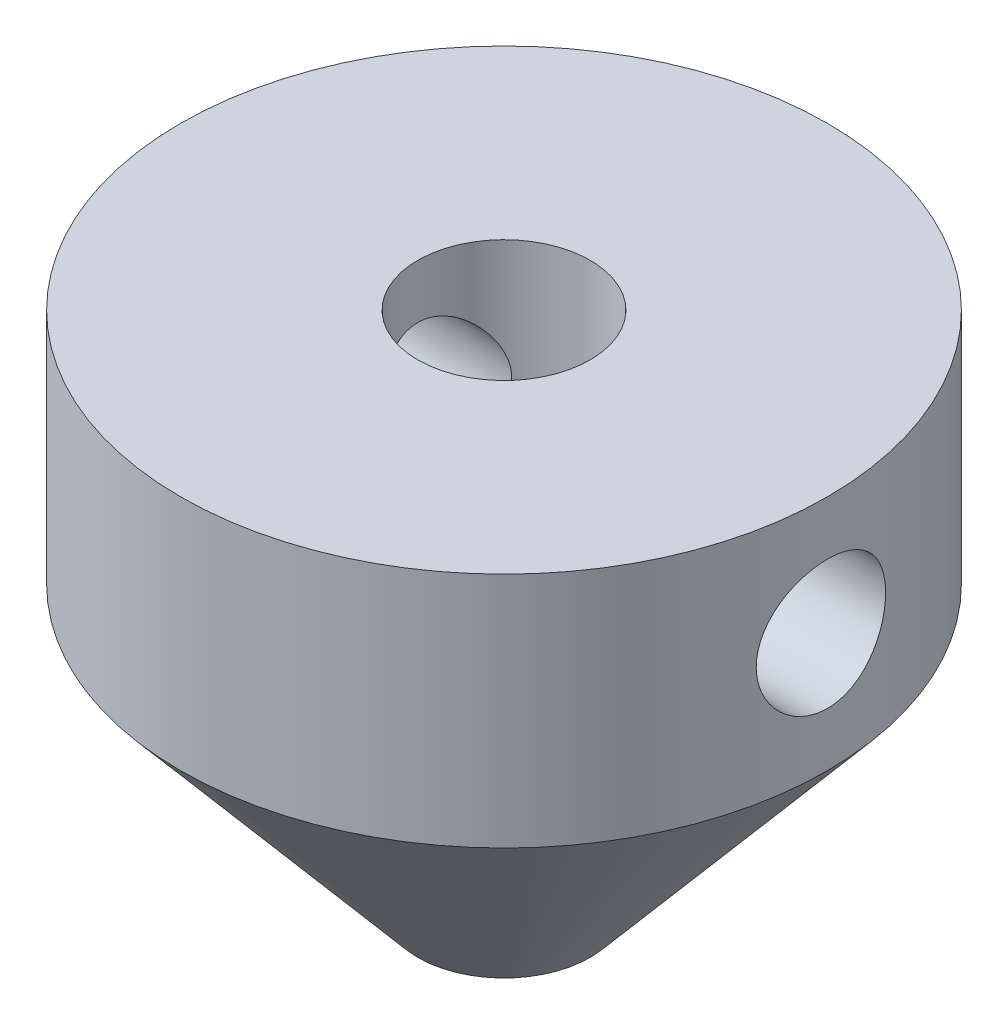
ISO-10303-21;
HEADER;
FILE_DESCRIPTION(('STEP AP214'),'2;1');
FILE_NAME('part.step','',(''),(''),'','','');
FILE_SCHEMA(('AUTOMOTIVE_DESIGN { 1 0 10303 214 1 1 1 1 }'));
ENDSEC;
DATA;
#1=APPLICATION_CONTEXT('core data for automotive mechanical design processes');
#2=APPLICATION_PROTOCOL_DEFINITION('international standard','automotive_design',2000,#1);
#3=PRODUCT_CONTEXT('',#1,'mechanical');
#4=PRODUCT('Part','Part','',(#3));
#5=PRODUCT_RELATED_PRODUCT_CATEGORY('part','',(#4));
#6=PRODUCT_DEFINITION_FORMATION('','',#4);
#7=PRODUCT_DEFINITION_CONTEXT('part definition',#1,'design');
#8=PRODUCT_DEFINITION('design','',#6,#7);
#9=PRODUCT_DEFINITION_SHAPE('','',#8);
#10=(LENGTH_UNIT() NAMED_UNIT(*) SI_UNIT(.MILLI.,.METRE.));
#11=(NAMED_UNIT(*) PLANE_ANGLE_UNIT() SI_UNIT($,.RADIAN.));
#12=(NAMED_UNIT(*) SI_UNIT($,.STERADIAN.) SOLID_ANGLE_UNIT());
#13=UNCERTAINTY_MEASURE_WITH_UNIT(LENGTH_MEASURE(1.E-05),#10,'distance_accuracy_value','');
#14=(GEOMETRIC_REPRESENTATION_CONTEXT(3) GLOBAL_UNCERTAINTY_ASSIGNED_CONTEXT((#13)) GLOBAL_UNIT_ASSIGNED_CONTEXT((#10,
#11,#12)) REPRESENTATION_CONTEXT('',''));
#15=CARTESIAN_POINT('',(0.,0.,0.));
#16=DIRECTION('',(0.,0.,1.));
#17=DIRECTION('',(1.,0.,0.));
#18=AXIS2_PLACEMENT_3D('',#15,#16,#17);
#19=CARTESIAN_POINT('',(-7.5,-2.75,0.));
#20=DIRECTION('',(1.,0.,0.));
#21=DIRECTION('',(0.,0.,-1.));
#22=AXIS2_PLACEMENT_3D('',#19,#20,#21);
#23=CYLINDRICAL_SURFACE('',#22,1.5);
#24=CARTESIAN_POINT('',(-1.32287565553229,-2.75,-1.5));
#25=CARTESIAN_POINT('',(-1.32289190044095,-2.68000257657437,-1.49999219049447));
#26=CARTESIAN_POINT('',(-1.32856366615417,-2.60995416568808,-1.4950410907442));
#27=CARTESIAN_POINT('',(-1.34990644032801,-2.47267014379052,-1.47578333210409));
#28=CARTESIAN_POINT('',(-1.3656072516867,-2.40544355498049,-1.46144878565587));
#29=CARTESIAN_POINT('',(-1.4037512791687,-2.27642015326163,-1.42483838991846));
#30=CARTESIAN_POINT('',(-1.42609848244814,-2.21456122323754,-1.40267483444956));
#31=CARTESIAN_POINT('',(-1.47486455031267,-2.09565454555481,-1.35130655299363));
#32=CARTESIAN_POINT('',(-1.50128292264932,-2.03860621753078,-1.3221026780169));
#33=CARTESIAN_POINT('',(-1.56177312961147,-1.91788720368341,-1.25039909811054));
#34=CARTESIAN_POINT('',(-1.59628904009787,-1.85533206577353,-1.20639573950363));
#35=CARTESIAN_POINT('',(-1.66521164096378,-1.73747453375773,-1.10933596759308));
#36=CARTESIAN_POINT('',(-1.69961809339876,-1.68218303517973,-1.05626622282799));
#37=CARTESIAN_POINT('',(-1.77262582436251,-1.56914126134453,-0.929610192252514));
#38=CARTESIAN_POINT('',(-1.81064921229759,-1.51319403328015,-0.854047289142163));
#39=CARTESIAN_POINT('',(-1.87882809751632,-1.41537779171717,-0.69118971482194));
#40=CARTESIAN_POINT('',(-1.90900204180106,-1.37347570253119,-0.603923293836167));
#41=CARTESIAN_POINT('',(-1.95034258990248,-1.31679231409706,-0.447869023983645));
#42=CARTESIAN_POINT('',(-1.96449710921006,-1.29764290402153,-0.381446049692536));
#43=CARTESIAN_POINT('',(-1.98605635937555,-1.26860988400325,-0.245552609316542));
#44=CARTESIAN_POINT('',(-1.99346695432364,-1.25871822389326,-0.176084845995169));
#45=CARTESIAN_POINT('',(-2.00091375578087,-1.24877826613751,-0.0358650926220277));
#46=CARTESIAN_POINT('',(-2.00093080057495,-1.24875554562356,0.0348897591186388));
#47=CARTESIAN_POINT('',(-1.99354206503066,-1.25861793678029,0.175316156674036));
#48=CARTESIAN_POINT('',(-1.98613456571337,-1.26850534290815,0.244987447822227));
#49=CARTESIAN_POINT('',(-1.96491377944411,-1.29708105058987,0.378889193792651));
#50=CARTESIAN_POINT('',(-1.9513285776568,-1.31545632638708,0.443224268236295));
#51=CARTESIAN_POINT('',(-1.91882278657017,-1.35999564218224,0.567680485046397));
#52=CARTESIAN_POINT('',(-1.89990103394193,-1.38616138051316,0.627800705033636));
#53=CARTESIAN_POINT('',(-1.85561045984504,-1.44852961514532,0.74921692186473));
#54=CARTESIAN_POINT('',(-1.82976540608097,-1.48551209661876,0.809935384713598));
#55=CARTESIAN_POINT('',(-1.77460702483739,-1.56673370397052,0.924567250548284));
#56=CARTESIAN_POINT('',(-1.74529074780453,-1.6109790136999,0.978474784621221));
#57=CARTESIAN_POINT('',(-1.6789376587236,-1.71522334882094,1.08908204283329));
#58=CARTESIAN_POINT('',(-1.64151655866368,-1.7766092100264,1.14424493004784));
#59=CARTESIAN_POINT('',(-1.56725958283769,-1.90783458362195,1.24400875556228));
#60=CARTESIAN_POINT('',(-1.53042399363524,-1.97767809952506,1.28860466211477));
#61=CARTESIAN_POINT('',(-1.46819425999159,-2.11098187024563,1.358732064116));
#62=CARTESIAN_POINT('',(-1.44197599789983,-2.17298704530065,1.38628866868102));
#63=CARTESIAN_POINT('',(-1.39536741257394,-2.30206528141938,1.43319397108784));
#64=CARTESIAN_POINT('',(-1.37496395320511,-2.36912647969037,1.45256121808259));
#65=CARTESIAN_POINT('',(-1.34640050620232,-2.49368694399832,1.47902385350669));
#66=CARTESIAN_POINT('',(-1.3366153955687,-2.55044708211686,1.48779069496582));
#67=CARTESIAN_POINT('',(-1.32435588438334,-2.66535546617383,1.49871760619789));
#68=CARTESIAN_POINT('',(-1.32187213058307,-2.72350183990282,1.50088612873265));
#69=CARTESIAN_POINT('',(-1.32462868790497,-2.8394789917334,1.49845270115552));
#70=CARTESIAN_POINT('',(-1.32987184207164,-2.89730964580967,1.4938482589949));
#71=CARTESIAN_POINT('',(-1.34721218775046,-3.01107615244287,1.47822527271969));
#72=CARTESIAN_POINT('',(-1.35932107727345,-3.0670085979481,1.46719578056394));
#73=CARTESIAN_POINT('',(-1.39427758287802,-3.19633804493887,1.43413959562387));
#74=CARTESIAN_POINT('',(-1.41944823697315,-3.26843595391503,1.40954189769242));
#75=CARTESIAN_POINT('',(-1.47537861079975,-3.40630766364012,1.35088877838435));
#76=CARTESIAN_POINT('',(-1.5061485847723,-3.47206951729475,1.31681594335477));
#77=CARTESIAN_POINT('',(-1.5710828237565,-3.59934900804812,1.23869774116696));
#78=CARTESIAN_POINT('',(-1.60532883846046,-3.66063287621826,1.19434110060341));
#79=CARTESIAN_POINT('',(-1.67347506272361,-3.77600209636125,1.09682562914592));
#80=CARTESIAN_POINT('',(-1.70737509574665,-3.83008392798894,1.04366252194463));
#81=CARTESIAN_POINT('',(-1.77960222623532,-3.94127699162937,0.916234513829622));
#82=CARTESIAN_POINT('',(-1.81728174165357,-3.9964752388576,0.839896270946857));
#83=CARTESIAN_POINT('',(-1.88453104769825,-4.09262073345087,0.675551612651268));
#84=CARTESIAN_POINT('',(-1.91411836052283,-4.13359882458129,0.587571029974851));
#85=CARTESIAN_POINT('',(-1.95419406402379,-4.18843799144687,0.430755661496911));
#86=CARTESIAN_POINT('',(-1.9677547802964,-4.20675679327544,0.364250057327472));
#87=CARTESIAN_POINT('',(-1.98810265589123,-4.23412879630752,0.228364464964352));
#88=CARTESIAN_POINT('',(-1.9948958710696,-4.24319028154851,0.158987104561943));
#89=CARTESIAN_POINT('',(-2.00113566717062,-4.25151639092861,0.0191476059403991));
#90=CARTESIAN_POINT('',(-2.00056500218907,-4.25075801734825,-0.0513166925870871));
#91=CARTESIAN_POINT('',(-1.9920880324381,-4.23943900869876,-0.19100901103008));
#92=CARTESIAN_POINT('',(-1.98417977344351,-4.22887576229252,-0.260236696591288));
#93=CARTESIAN_POINT('',(-1.96203400925195,-4.19902508383276,-0.393521935254971));
#94=CARTESIAN_POINT('',(-1.94798690792879,-4.17999981867845,-0.457671236511441));
#95=CARTESIAN_POINT('',(-1.91462720575136,-4.13421193438106,-0.581661343097388));
#96=CARTESIAN_POINT('',(-1.89531347862386,-4.10744766016909,-0.641501223388814));
#97=CARTESIAN_POINT('',(-1.8501764221064,-4.04372206240404,-0.762547698766812));
#98=CARTESIAN_POINT('',(-1.82386352707581,-4.00594906864042,-0.823141236713417));
#99=CARTESIAN_POINT('',(-1.76785506075717,-3.92313355944579,-0.937414811724214));
#100=CARTESIAN_POINT('',(-1.73815638795658,-3.87808436271395,-0.991088412383373));
#101=CARTESIAN_POINT('',(-1.67106353042106,-3.77199463343921,-1.10112380660681));
#102=CARTESIAN_POINT('',(-1.63330922504697,-3.7095536005601,-1.15591691541996));
#103=CARTESIAN_POINT('',(-1.55866082463332,-3.57613192810013,-1.2547525342935));
#104=CARTESIAN_POINT('',(-1.52176704921892,-3.50514817396344,-1.29879110556729));
#105=CARTESIAN_POINT('',(-1.46049601449284,-3.3711167494097,-1.36695971301455));
#106=CARTESIAN_POINT('',(-1.43513625007637,-3.30966501729344,-1.39333526337998));
#107=CARTESIAN_POINT('',(-1.39032564651232,-3.18191708694412,-1.43805398028599));
#108=CARTESIAN_POINT('',(-1.37085915899696,-3.11563430840455,-1.45641847678344));
#109=CARTESIAN_POINT('',(-1.34532423383262,-2.99921178040307,-1.4799705775638));
#110=CARTESIAN_POINT('',(-1.3370013026568,-2.95003292870954,-1.48744249026867));
#111=CARTESIAN_POINT('',(-1.32577295392455,-2.85057766696635,-1.49745839072448));
#112=CARTESIAN_POINT('',(-1.32286398151145,-2.80030199905628,-1.50000561211714));
#113=CARTESIAN_POINT('',(-1.32287565553229,-2.75,-1.5));
#114=B_SPLINE_CURVE_WITH_KNOTS('',3,(#24,#25,#26,#27,#28,#29,#30,#31,#32,#33,#34,#35,#36,#37,
#38,#39,#40,#41,#42,#43,#44,#45,#46,#47,#48,#49,#50,#51,#52,#53,#54,#55,#56,#57,#58,#59,#60,#61,
#62,#63,#64,#65,#66,#67,#68,#69,#70,#71,#72,#73,#74,#75,#76,#77,#78,#79,#80,#81,#82,#83,#84,#85,
#86,#87,#88,#89,#90,#91,#92,#93,#94,#95,#96,#97,#98,#99,#100,#101,#102,#103,#104,#105,#106,#107,
#108,#109,#110,#111,#112,#113),.UNSPECIFIED.,.T.,.F.,(4,2,2,2,2,2,2,2,2,2,2,2,2,2,2,2,2,2,2,2,2,
2,2,2,2,2,2,2,2,2,2,2,2,2,2,2,2,2,2,2,2,2,2,2,4),(0.,0.20973177668449,0.420089722582994,
0.627545385620139,0.834975984672345,1.08585208691169,1.33710031031849,1.63964848103538,
1.94147907444963,2.15227725277555,2.36289195870711,2.57405250727807,2.78526195641288,
2.9892375589505,3.19325766108669,3.41936844116895,3.64567274887663,3.91649517204702,
4.18744629647933,4.40499409477196,4.62204646613006,4.79608005545901,4.96989060538193,
5.14376512326213,5.31793678696019,5.55730028202397,5.79710662639151,6.0454320909006,
6.29387849446618,6.59652499511463,6.89851088586565,7.10852896194427,7.31835893539181,
7.52868041101043,7.73905791773945,7.94332812691912,8.14764205379332,8.3751005248961,
8.60276905744644,8.87547580578155,9.14828228208531,9.36218279640835,9.57551025772699,
9.72632812073766,9.87704692032409),.UNSPECIFIED.);
#115=CARTESIAN_POINT('',(-1.32287565553229,-2.75,-1.5));
#116=VERTEX_POINT('',#115);
#117=EDGE_CURVE('E34',#116,#116,#114,.T.);
#118=ORIENTED_EDGE('',*,*,#117,.T.);
#119=EDGE_LOOP('',(#118));
#120=FACE_BOUND('',#119,.T.);
#121=CARTESIAN_POINT('',(-7.5,-4.25,0.));
#122=CARTESIAN_POINT('',(-7.49999846371307,-4.24999693325248,-0.0833653601889498));
#123=CARTESIAN_POINT('',(-7.49859577767346,-4.24302673554853,-0.166769490302284));
#124=CARTESIAN_POINT('',(-7.49313548434847,-4.21535224982713,-0.331220261533529));
#125=CARTESIAN_POINT('',(-7.48907576790279,-4.19463705079774,-0.412264976312034));
#126=CARTESIAN_POINT('',(-7.4787547391743,-4.14013808956882,-0.56959545789497));
#127=CARTESIAN_POINT('',(-7.47249553615077,-4.10636684473297,-0.645885701899702));
#128=CARTESIAN_POINT('',(-7.45845597052971,-4.02675162873306,-0.791711983296339));
#129=CARTESIAN_POINT('',(-7.4506756985356,-3.98090837658919,-0.861248422613718));
#130=CARTESIAN_POINT('',(-7.43433247994955,-3.87779225856285,-0.992540215972298));
#131=CARTESIAN_POINT('',(-7.42576118256521,-3.8203874669132,-1.05419092673779));
#132=CARTESIAN_POINT('',(-7.40886270678882,-3.69606137541245,-1.16705513491204));
#133=CARTESIAN_POINT('',(-7.40053554750636,-3.62913933299732,-1.21826781715564));
#134=CARTESIAN_POINT('',(-7.38498662718923,-3.48692571048219,-1.30924763002143));
#135=CARTESIAN_POINT('',(-7.37777561047419,-3.41156353430546,-1.3489064082988));
#136=CARTESIAN_POINT('',(-7.36539402087627,-3.25507727149388,-1.41495849987046));
#137=CARTESIAN_POINT('',(-7.36022324642942,-3.17395375498048,-1.44135312365586));
#138=CARTESIAN_POINT('',(-7.35259207878307,-3.00937345413813,-1.47978794982724));
#139=CARTESIAN_POINT('',(-7.35009705160781,-2.92596118378666,-1.49201174693817));
#140=CARTESIAN_POINT('',(-7.34799562590941,-2.75823526795349,-1.50232819158918));
#141=CARTESIAN_POINT('',(-7.34838893201761,-2.67392171551978,-1.50042228407025));
#142=CARTESIAN_POINT('',(-7.35198826722277,-2.5081298179685,-1.48268185965273));
#143=CARTESIAN_POINT('',(-7.35515179288145,-2.42662789155903,-1.46705781036586));
#144=CARTESIAN_POINT('',(-7.36386819240002,-2.2674258850055,-1.42265682693458));
#145=CARTESIAN_POINT('',(-7.36942118036668,-2.18972598662149,-1.39387926465102));
#146=CARTESIAN_POINT('',(-7.38233427750612,-2.0397271074446,-1.32378717551208));
#147=CARTESIAN_POINT('',(-7.38970634720557,-1.96746818064624,-1.28238922684817));
#148=CARTESIAN_POINT('',(-7.40541928159593,-1.83084372504078,-1.18829036185902));
#149=CARTESIAN_POINT('',(-7.41376025757549,-1.76647910472326,-1.13558814653524));
#150=CARTESIAN_POINT('',(-7.43065531862193,-1.6462558963146,-1.01924990184088));
#151=CARTESIAN_POINT('',(-7.43921053816357,-1.59057114821131,-0.955434241818667));
#152=CARTESIAN_POINT('',(-7.45543273071613,-1.49066923054817,-0.819277536093015));
#153=CARTESIAN_POINT('',(-7.4630996923346,-1.44645220805963,-0.746936381069084));
#154=CARTESIAN_POINT('',(-7.47670035241331,-1.37070873616104,-0.595589080318381));
#155=CARTESIAN_POINT('',(-7.48263133272408,-1.3392021595332,-0.51657272937795));
#156=CARTESIAN_POINT('',(-7.49207113481787,-1.28995928894215,-0.354223464672997));
#157=CARTESIAN_POINT('',(-7.49558025000797,-1.27222132688956,-0.270891075108674));
#158=CARTESIAN_POINT('',(-7.49974007800302,-1.25126531930859,-0.103769108440725));
#159=CARTESIAN_POINT('',(-7.50043761978705,-1.2478093706896,-0.0200104924883639));
#160=CARTESIAN_POINT('',(-7.49902577895154,-1.25487478841327,0.146887401289071));
#161=CARTESIAN_POINT('',(-7.49691655412169,-1.26539536902889,0.23002671366569));
#162=CARTESIAN_POINT('',(-7.49015748012026,-1.29991756031594,0.392558489919812));
#163=CARTESIAN_POINT('',(-7.4855306460631,-1.32379710274686,0.471977922509855));
#164=CARTESIAN_POINT('',(-7.47425328091549,-1.38422597398372,0.625685441249501));
#165=CARTESIAN_POINT('',(-7.4676025982134,-1.42077625201525,0.69997314245631));
#166=CARTESIAN_POINT('',(-7.45289867299942,-1.50602373597697,0.842311760529327));
#167=CARTESIAN_POINT('',(-7.44482925655578,-1.55486417155842,0.910275190128283));
#168=CARTESIAN_POINT('',(-7.42822102244824,-1.66311378681092,1.03712702867881));
#169=CARTESIAN_POINT('',(-7.41968215452582,-1.7225240995998,1.09601446339614));
#170=CARTESIAN_POINT('',(-7.40293955335447,-1.85131002783669,1.20396088616126));
#171=CARTESIAN_POINT('',(-7.39474290349956,-1.92082361633201,1.25285655367298));
#172=CARTESIAN_POINT('',(-7.37976287694291,-2.06721704203502,1.33827813007681));
#173=CARTESIAN_POINT('',(-7.37297944370014,-2.14409658436033,1.37480453388435));
#174=CARTESIAN_POINT('',(-7.36165110876574,-2.30265236922432,1.43422776237294));
#175=CARTESIAN_POINT('',(-7.3570946230828,-2.38430126181548,1.45719524968658));
#176=CARTESIAN_POINT('',(-7.35071155188038,-2.55040018023636,1.48906297744079));
#177=CARTESIAN_POINT('',(-7.34888461036667,-2.63484983931402,1.49796505233767));
#178=CARTESIAN_POINT('',(-7.34818724447069,-2.80251329681648,1.5013813663012));
#179=CARTESIAN_POINT('',(-7.34926378783951,-2.88572172339052,1.49615368210634));
#180=CARTESIAN_POINT('',(-7.35413360226921,-3.05004747485754,1.47202845615009));
#181=CARTESIAN_POINT('',(-7.35792685150754,-3.13116481654221,1.45313102419395));
#182=CARTESIAN_POINT('',(-7.36777896328738,-3.28884156686082,1.40231785274843));
#183=CARTESIAN_POINT('',(-7.37383231528246,-3.36541154075363,1.37043376007602));
#184=CARTESIAN_POINT('',(-7.38752572461255,-3.51215558110166,1.29458196690241));
#185=CARTESIAN_POINT('',(-7.39516591498341,-3.58232911058771,1.25061325316232));
#186=CARTESIAN_POINT('',(-7.41133440784838,-3.71557335822547,1.15095887217962));
#187=CARTESIAN_POINT('',(-7.41987559364549,-3.7785031479014,1.09508683085277));
#188=CARTESIAN_POINT('',(-7.43679122807932,-3.89417930829376,0.973596553519711));
#189=CARTESIAN_POINT('',(-7.44516563794777,-3.94692333547591,0.907976080730002));
#190=CARTESIAN_POINT('',(-7.46090748581957,-4.04125196591967,0.768026443632369));
#191=CARTESIAN_POINT('',(-7.46826346828869,-4.08271400492004,0.693613326644751));
#192=CARTESIAN_POINT('',(-7.481026876275,-4.15247918389489,0.538749541411098));
#193=CARTESIAN_POINT('',(-7.48643605707924,-4.18079418429874,0.458304391294689));
#194=CARTESIAN_POINT('',(-7.49364558893056,-4.21797792206708,0.314732233385669));
#195=CARTESIAN_POINT('',(-7.49601454737677,-4.22996479056164,0.252422496020677));
#196=CARTESIAN_POINT('',(-7.49919231209839,-4.24597686853755,0.1267492878151));
#197=CARTESIAN_POINT('',(-7.50000116809732,-4.25000233176465,0.0633858506229285));
#198=CARTESIAN_POINT('',(-7.5,-4.25,0.));
#199=B_SPLINE_CURVE_WITH_KNOTS('',3,(#121,#122,#123,#124,#125,#126,#127,#128,#129,#130,#131,
#132,#133,#134,#135,#136,#137,#138,#139,#140,#141,#142,#143,#144,#145,#146,#147,#148,#149,#150,
#151,#152,#153,#154,#155,#156,#157,#158,#159,#160,#161,#162,#163,#164,#165,#166,#167,#168,#169,
#170,#171,#172,#173,#174,#175,#176,#177,#178,#179,#180,#181,#182,#183,#184,#185,#186,#187,#188,
#189,#190,#191,#192,#193,#194,#195,#196,#197,#198),.UNSPECIFIED.,.T.,.F.,(4,2,2,2,2,2,2,2,2,2,2,
2,2,2,2,2,2,2,2,2,2,2,2,2,2,2,2,2,2,2,2,2,2,2,2,2,2,2,4),(0.,0.249864195991888,
0.499926976036985,0.749750602875513,0.999559353346295,1.25239900516828,1.50525839512105,
1.76041792508884,2.01555224047796,2.26734277655381,2.51910756421838,2.76707590509417,
3.01505608880594,3.26471235305389,3.51439732124506,3.76857378737026,4.0227535130973,
4.27732912281036,4.53187388547054,4.78216103514398,5.03243411486801,5.28045680926085,
5.52849808824034,5.77957599050038,6.03068082518895,6.28560942868839,6.540527830852,
6.79410571549085,7.04765052495622,7.29659583851552,7.54553915238913,7.79387941879665,
8.042240513728,8.29482114358715,8.54745981799396,8.80274245013456,9.05779433276278,
9.24778162934841,9.43776287056494),.UNSPECIFIED.);
#200=CARTESIAN_POINT('',(-7.5,-4.25,0.));
#201=VERTEX_POINT('',#200);
#202=EDGE_CURVE('E10',#201,#201,#199,.T.);
#203=ORIENTED_EDGE('',*,*,#202,.F.);
#204=EDGE_LOOP('',(#203));
#205=FACE_BOUND('',#204,.T.);
#206=ADVANCED_FACE('F30',(#120,#205),#23,.F.);
#207=CARTESIAN_POINT('',(0.,0.,0.));
#208=DIRECTION('',(0.,-1.,0.));
#209=DIRECTION('',(0.,0.,-1.));
#210=AXIS2_PLACEMENT_3D('',#207,#208,#209);
#211=PLANE('',#210);
#212=CARTESIAN_POINT('',(0.,0.,0.));
#213=DIRECTION('',(0.,1.,0.));
#214=DIRECTION('',(0.,0.,1.));
#215=AXIS2_PLACEMENT_3D('',#212,#213,#214);
#216=CIRCLE('',#215,2.);
#217=CARTESIAN_POINT('',(0.,0.,2.));
#218=VERTEX_POINT('',#217);
#219=EDGE_CURVE('E98',#218,#218,#216,.T.);
#220=ORIENTED_EDGE('',*,*,#219,.F.);
#221=EDGE_LOOP('',(#220));
#222=FACE_BOUND('',#221,.T.);
#223=CARTESIAN_POINT('',(0.,0.,0.));
#224=DIRECTION('',(0.,-1.,0.));
#225=DIRECTION('',(0.,0.,-1.));
#226=AXIS2_PLACEMENT_3D('',#223,#224,#225);
#227=CIRCLE('',#226,7.5);
#228=CARTESIAN_POINT('',(0.,0.,-7.5));
#229=VERTEX_POINT('',#228);
#230=EDGE_CURVE('E48',#229,#229,#227,.T.);
#231=ORIENTED_EDGE('',*,*,#230,.F.);
#232=EDGE_LOOP('',(#231));
#233=FACE_BOUND('',#232,.T.);
#234=ADVANCED_FACE('F32',(#222,#233),#211,.F.);
#235=CARTESIAN_POINT('',(0.,-12.,0.));
#236=DIRECTION('',(0.,-1.,0.));
#237=DIRECTION('',(0.,0.,-1.));
#238=AXIS2_PLACEMENT_3D('',#235,#236,#237);
#239=CYLINDRICAL_SURFACE('',#238,7.5);
#240=ORIENTED_EDGE('',*,*,#202,.T.);
#241=EDGE_LOOP('',(#240));
#242=FACE_BOUND('',#241,.T.);
#243=CARTESIAN_POINT('',(7.34846922834953,-2.75,-1.5));
#244=CARTESIAN_POINT('',(7.34847088538349,-2.83334656323576,-1.49999691881235));
#245=CARTESIAN_POINT('',(7.34990262402618,-2.91673193499975,-1.49302975757707));
#246=CARTESIAN_POINT('',(7.35546646957746,-3.08114375771496,-1.46536842537441));
#247=CARTESIAN_POINT('',(7.35960073717297,-3.16216826695404,-1.44466327060578));
#248=CARTESIAN_POINT('',(7.37008310582665,-3.31945595503125,-1.39019367392958));
#249=CARTESIAN_POINT('',(7.37642900431582,-3.39572378229887,-1.35644222122892));
#250=CARTESIAN_POINT('',(7.39061699221019,-3.54151226704545,-1.27687366150577));
#251=CARTESIAN_POINT('',(7.398458998102,-3.61103330080686,-1.23105722790173));
#252=CARTESIAN_POINT('',(7.4148794954137,-3.74234150578079,-1.12796861348015));
#253=CARTESIAN_POINT('',(7.42346606755867,-3.80401938182596,-1.07055848386998));
#254=CARTESIAN_POINT('',(7.440337084539,-3.91693630036847,-0.946210183531966));
#255=CARTESIAN_POINT('',(7.44862150816248,-3.96817461112579,-0.879271345466977));
#256=CARTESIAN_POINT('',(7.46404194626342,-4.05918202644269,-0.737042033886384));
#257=CARTESIAN_POINT('',(7.47116732162326,-4.09884727072496,-0.661683851508316));
#258=CARTESIAN_POINT('',(7.48337605325447,-4.16491240557221,-0.505206225580907));
#259=CARTESIAN_POINT('',(7.48845960066179,-4.19131353785149,-0.42408732213083));
#260=CARTESIAN_POINT('',(7.49595481032628,-4.22976079042944,-0.259525159917742));
#261=CARTESIAN_POINT('',(7.4984007943219,-4.24199146635651,-0.176126608822221));
#262=CARTESIAN_POINT('',(7.50046381775405,-4.25232642775747,-0.00842785265630482));
#263=CARTESIAN_POINT('',(7.50008112979138,-4.25043207446873,0.0758722647477644));
#264=CARTESIAN_POINT('',(7.49655652302773,-4.23271072967667,0.241713001115383));
#265=CARTESIAN_POINT('',(7.49345397548757,-4.21708253424823,0.323275821447705));
#266=CARTESIAN_POINT('',(7.48488265739113,-4.17265245131166,0.482597439870452));
#267=CARTESIAN_POINT('',(7.47941379216059,-4.14385003671219,0.560356085620693));
#268=CARTESIAN_POINT('',(7.46665944029938,-4.0737049397791,0.710429194801331));
#269=CARTESIAN_POINT('',(7.45936272262835,-4.03228437334267,0.782706261200849));
#270=CARTESIAN_POINT('',(7.44375704210678,-3.9381363841451,0.919357568789633));
#271=CARTESIAN_POINT('',(7.43544796282833,-3.88540766034423,0.983730899287501));
#272=CARTESIAN_POINT('',(7.41856446546689,-3.76904956683729,1.10392714658019));
#273=CARTESIAN_POINT('',(7.40998794686274,-3.70524621990562,1.15958147486045));
#274=CARTESIAN_POINT('',(7.39367357398141,-3.56912533632387,1.25942773976521));
#275=CARTESIAN_POINT('',(7.38593573556822,-3.49680763867521,1.30361945959163));
#276=CARTESIAN_POINT('',(7.37217071209385,-3.34546875226729,1.37934422220282));
#277=CARTESIAN_POINT('',(7.36614722345324,-3.26643354854051,1.41084997166656));
#278=CARTESIAN_POINT('',(7.35654714481909,-3.10404301441402,1.46008551244137));
#279=CARTESIAN_POINT('',(7.35297023592642,-3.02068824857138,1.47781709918496));
#280=CARTESIAN_POINT('',(7.34873218901742,-2.85355271300143,1.49874900905408));
#281=CARTESIAN_POINT('',(7.34802220585731,-2.76980363853449,1.50219278834687));
#282=CARTESIAN_POINT('',(7.34946728533281,-2.60292766520048,1.49510644246611));
#283=CARTESIAN_POINT('',(7.35162218550582,-2.51980073132171,1.48457710968366));
#284=CARTESIAN_POINT('',(7.35850848742372,-2.35734703956165,1.45005331211124));
#285=CARTESIAN_POINT('',(7.36321498521745,-2.27799148544636,1.42618893125895));
#286=CARTESIAN_POINT('',(7.37465234027497,-2.12440508145689,1.36581155296278));
#287=CARTESIAN_POINT('',(7.38138336429404,-2.05017465434642,1.32929751355977));
#288=CARTESIAN_POINT('',(7.39622108943059,-1.90788033507476,1.2441062133234));
#289=CARTESIAN_POINT('',(7.40434457797355,-1.83990943054876,1.19527661697413));
#290=CARTESIAN_POINT('',(7.42100585739955,-1.71303753199863,1.08704335831907));
#291=CARTESIAN_POINT('',(7.42954369085727,-1.65413747262612,1.02763860771681));
#292=CARTESIAN_POINT('',(7.44623018803823,-1.54615616122164,0.898848410246836));
#293=CARTESIAN_POINT('',(7.45437086563026,-1.49723951802501,0.829323748394445));
#294=CARTESIAN_POINT('',(7.4692069144293,-1.41178117775063,0.682901844952133));
#295=CARTESIAN_POINT('',(7.47590234632816,-1.37523896098283,0.60600491315026));
#296=CARTESIAN_POINT('',(7.487059410916,-1.31580669238005,0.447454021236019));
#297=CARTESIAN_POINT('',(7.49153368713906,-1.29283922266062,0.365830010217117));
#298=CARTESIAN_POINT('',(7.4977985390649,-1.26096312850423,0.199784182019869));
#299=CARTESIAN_POINT('',(7.49958943799765,-1.25205281078648,0.115362703066821));
#300=CARTESIAN_POINT('',(7.50027810681181,-1.24860952855567,-0.0523093408554353));
#301=CARTESIAN_POINT('',(7.49922567824026,-1.25382907931568,-0.135554718212254));
#302=CARTESIAN_POINT('',(7.49445065340477,-1.27795092582172,-0.299956546973463));
#303=CARTESIAN_POINT('',(7.49072809071528,-1.29685304952211,-0.381113024630537));
#304=CARTESIAN_POINT('',(7.481032475475,-1.34769348813747,-0.538879124617644));
#305=CARTESIAN_POINT('',(7.47506455871866,-1.37960206719678,-0.615498664860421));
#306=CARTESIAN_POINT('',(7.46152083185077,-1.45551836199635,-0.762331830278929));
#307=CARTESIAN_POINT('',(7.45394489468828,-1.49952703385557,-0.832544948651118));
#308=CARTESIAN_POINT('',(7.43786398736791,-1.59922908059313,-0.965795835159536));
#309=CARTESIAN_POINT('',(7.4293460013317,-1.65509950458017,-1.02869957417475));
#310=CARTESIAN_POINT('',(7.41241834355477,-1.77657536014365,-1.14432392663527));
#311=CARTESIAN_POINT('',(7.40400869794476,-1.84218309420307,-1.19704212480408));
#312=CARTESIAN_POINT('',(7.3881501412478,-1.98211897505031,-1.29133832918279));
#313=CARTESIAN_POINT('',(7.38071255446371,-2.05653344174069,-1.33279022195961));
#314=CARTESIAN_POINT('',(7.36777855777287,-2.2113991599494,-1.40253607393175));
#315=CARTESIAN_POINT('',(7.36228038807748,-2.29184485804635,-1.43084196896908));
#316=CARTESIAN_POINT('',(7.3549452169166,-2.43539368315525,-1.4680037097813));
#317=CARTESIAN_POINT('',(7.35253177367824,-2.49767812926849,-1.47998084778413));
#318=CARTESIAN_POINT('',(7.34929317692711,-2.62330093182915,-1.49598002694097));
#319=CARTESIAN_POINT('',(7.34846796865859,-2.68663925186744,-1.50000234234439));
#320=CARTESIAN_POINT('',(7.34846922834953,-2.75,-1.5));
#321=B_SPLINE_CURVE_WITH_KNOTS('',3,(#243,#244,#245,#246,#247,#248,#249,#250,#251,#252,#253,
#254,#255,#256,#257,#258,#259,#260,#261,#262,#263,#264,#265,#266,#267,#268,#269,#270,#271,#272,
#273,#274,#275,#276,#277,#278,#279,#280,#281,#282,#283,#284,#285,#286,#287,#288,#289,#290,#291,
#292,#293,#294,#295,#296,#297,#298,#299,#300,#301,#302,#303,#304,#305,#306,#307,#308,#309,#310,
#311,#312,#313,#314,#315,#316,#317,#318,#319,#320),.UNSPECIFIED.,.T.,.F.,(4,2,2,2,2,2,2,2,2,2,2,
2,2,2,2,2,2,2,2,2,2,2,2,2,2,2,2,2,2,2,2,2,2,2,2,2,2,2,4),(0.,0.249807695804142,
0.499815358926445,0.749574746910878,0.999320197289795,1.25223378822655,1.50516510053133,
1.76030100656175,2.0154130236984,2.26716373324621,2.51889018174372,2.76703184450306,
3.01518343610625,3.26489886333455,3.51464303655099,3.76874020143725,4.0228421718408,
4.27748794759165,4.53210052524037,4.7823563670689,5.03259801792632,5.28044012674978,
5.52830265531598,5.77939589661782,6.03051499305313,6.28548902600176,6.54045234945157,
6.79394720367975,7.04741152037442,7.29646526122029,7.54551587050135,7.79400025613178,
8.04250428202026,8.29501728038395,8.54759008334672,8.80288347868562,9.05794462633399,
9.24785705455344,9.43776293526322),.UNSPECIFIED.);
#322=CARTESIAN_POINT('',(7.34846922834953,-2.75,-1.5));
#323=VERTEX_POINT('',#322);
#324=EDGE_CURVE('E43',#323,#323,#321,.T.);
#325=ORIENTED_EDGE('',*,*,#324,.T.);
#326=EDGE_LOOP('',(#325));
#327=FACE_BOUND('',#326,.T.);
#328=CARTESIAN_POINT('',(0.,-5.5,0.));
#329=DIRECTION('',(0.,-1.,0.));
#330=DIRECTION('',(0.,0.,-1.));
#331=AXIS2_PLACEMENT_3D('',#328,#329,#330);
#332=CIRCLE('',#331,7.5);
#333=CARTESIAN_POINT('',(0.,-5.5,7.5));
#334=VERTEX_POINT('',#333);
#335=EDGE_CURVE('E92',#334,#334,#332,.T.);
#336=ORIENTED_EDGE('',*,*,#335,.F.);
#337=EDGE_LOOP('',(#336));
#338=FACE_BOUND('',#337,.T.);
#339=ORIENTED_EDGE('',*,*,#230,.T.);
#340=EDGE_LOOP('',(#339));
#341=FACE_BOUND('',#340,.T.);
#342=ADVANCED_FACE('F61',(#242,#327,#338,#341),#239,.T.);
#343=CARTESIAN_POINT('',(0.,-5.5,0.));
#344=DIRECTION('',(0.,1.,0.));
#345=DIRECTION('',(0.,0.,1.));
#346=AXIS2_PLACEMENT_3D('',#343,#344,#345);
#347=CONICAL_SURFACE('',#346,7.5,0.702256931509007);
#348=CARTESIAN_POINT('',(0.,-12.,0.));
#349=DIRECTION('',(0.,1.,0.));
#350=DIRECTION('',(0.,0.,1.));
#351=AXIS2_PLACEMENT_3D('',#348,#349,#350);
#352=CIRCLE('',#351,2.);
#353=CARTESIAN_POINT('',(0.,-12.,2.));
#354=VERTEX_POINT('',#353);
#355=EDGE_CURVE('E96',#354,#354,#352,.T.);
#356=CARTESIAN_POINT('',(0.,-12.,2.));
#357=CARTESIAN_POINT('',(0.,-11.9322916666667,2.05729166666667));
#358=CARTESIAN_POINT('',(0.,-11.8645833333333,2.11458333333333));
#359=CARTESIAN_POINT('',(0.,-11.7291666666667,2.22916666666667));
#360=CARTESIAN_POINT('',(0.,-11.6614583333333,2.28645833333333));
#361=CARTESIAN_POINT('',(0.,-11.5260416666667,2.40104166666667));
#362=CARTESIAN_POINT('',(0.,-11.4583333333333,2.45833333333333));
#363=CARTESIAN_POINT('',(0.,-11.3229166666667,2.57291666666667));
#364=CARTESIAN_POINT('',(0.,-11.2552083333333,2.63020833333333));
#365=CARTESIAN_POINT('',(0.,-11.1197916666667,2.74479166666667));
#366=CARTESIAN_POINT('',(0.,-11.0520833333333,2.80208333333333));
#367=CARTESIAN_POINT('',(0.,-10.9166666666667,2.91666666666667));
#368=CARTESIAN_POINT('',(0.,-10.8489583333333,2.97395833333333));
#369=CARTESIAN_POINT('',(0.,-10.7135416666667,3.08854166666667));
#370=CARTESIAN_POINT('',(0.,-10.6458333333333,3.14583333333333));
#371=CARTESIAN_POINT('',(0.,-10.5104166666667,3.26041666666667));
#372=CARTESIAN_POINT('',(0.,-10.4427083333333,3.31770833333333));
#373=CARTESIAN_POINT('',(0.,-10.3072916666667,3.43229166666667));
#374=CARTESIAN_POINT('',(0.,-10.2395833333333,3.48958333333333));
#375=CARTESIAN_POINT('',(0.,-10.1041666666667,3.60416666666667));
#376=CARTESIAN_POINT('',(0.,-10.0364583333333,3.66145833333333));
#377=CARTESIAN_POINT('',(0.,-9.90104166666667,3.77604166666667));
#378=CARTESIAN_POINT('',(0.,-9.83333333333333,3.83333333333333));
#379=CARTESIAN_POINT('',(0.,-9.69791666666667,3.94791666666667));
#380=CARTESIAN_POINT('',(0.,-9.63020833333333,4.00520833333333));
#381=CARTESIAN_POINT('',(0.,-9.49479166666667,4.11979166666667));
#382=CARTESIAN_POINT('',(0.,-9.42708333333333,4.17708333333333));
#383=CARTESIAN_POINT('',(0.,-9.29166666666667,4.29166666666667));
#384=CARTESIAN_POINT('',(0.,-9.22395833333333,4.34895833333333));
#385=CARTESIAN_POINT('',(0.,-9.08854166666667,4.46354166666667));
#386=CARTESIAN_POINT('',(0.,-9.02083333333333,4.52083333333333));
#387=CARTESIAN_POINT('',(0.,-8.88541666666667,4.63541666666667));
#388=CARTESIAN_POINT('',(0.,-8.81770833333333,4.69270833333333));
#389=CARTESIAN_POINT('',(0.,-8.68229166666667,4.80729166666667));
#390=CARTESIAN_POINT('',(0.,-8.61458333333333,4.86458333333333));
#391=CARTESIAN_POINT('',(0.,-8.47916666666667,4.97916666666667));
#392=CARTESIAN_POINT('',(0.,-8.41145833333333,5.03645833333333));
#393=CARTESIAN_POINT('',(0.,-8.27604166666667,5.15104166666667));
#394=CARTESIAN_POINT('',(0.,-8.20833333333333,5.20833333333333));
#395=CARTESIAN_POINT('',(0.,-8.07291666666667,5.32291666666667));
#396=CARTESIAN_POINT('',(0.,-8.00520833333333,5.38020833333333));
#397=CARTESIAN_POINT('',(0.,-7.86979166666667,5.49479166666667));
#398=CARTESIAN_POINT('',(0.,-7.80208333333333,5.55208333333333));
#399=CARTESIAN_POINT('',(0.,-7.66666666666667,5.66666666666667));
#400=CARTESIAN_POINT('',(0.,-7.59895833333333,5.72395833333333));
#401=CARTESIAN_POINT('',(0.,-7.46354166666667,5.83854166666667));
#402=CARTESIAN_POINT('',(0.,-7.39583333333333,5.89583333333333));
#403=CARTESIAN_POINT('',(0.,-7.26041666666667,6.01041666666667));
#404=CARTESIAN_POINT('',(0.,-7.19270833333333,6.06770833333333));
#405=CARTESIAN_POINT('',(0.,-7.05729166666667,6.18229166666667));
#406=CARTESIAN_POINT('',(0.,-6.98958333333333,6.23958333333333));
#407=CARTESIAN_POINT('',(0.,-6.85416666666667,6.35416666666667));
#408=CARTESIAN_POINT('',(0.,-6.78645833333333,6.41145833333333));
#409=CARTESIAN_POINT('',(0.,-6.65104166666667,6.52604166666667));
#410=CARTESIAN_POINT('',(0.,-6.58333333333333,6.58333333333333));
#411=CARTESIAN_POINT('',(0.,-6.44791666666667,6.69791666666667));
#412=CARTESIAN_POINT('',(0.,-6.38020833333333,6.75520833333333));
#413=CARTESIAN_POINT('',(0.,-6.24479166666667,6.86979166666667));
#414=CARTESIAN_POINT('',(0.,-6.17708333333333,6.92708333333333));
#415=CARTESIAN_POINT('',(0.,-6.04166666666667,7.04166666666667));
#416=CARTESIAN_POINT('',(0.,-5.97395833333333,7.09895833333333));
#417=CARTESIAN_POINT('',(0.,-5.83854166666667,7.21354166666667));
#418=CARTESIAN_POINT('',(0.,-5.77083333333333,7.27083333333333));
#419=CARTESIAN_POINT('',(0.,-5.63541666666667,7.38541666666667));
#420=CARTESIAN_POINT('',(0.,-5.56770833333333,7.44270833333333));
#421=CARTESIAN_POINT('',(0.,-5.5,7.5));
#422=B_SPLINE_CURVE_WITH_KNOTS('',3,(#356,#357,#358,#359,#360,#361,#362,#363,#364,#365,#366,
#367,#368,#369,#370,#371,#372,#373,#374,#375,#376,#377,#378,#379,#380,#381,#382,#383,#384,#385,
#386,#387,#388,#389,#390,#391,#392,#393,#394,#395,#396,#397,#398,#399,#400,#401,#402,#403,#404,
#405,#406,#407,#408,#409,#410,#411,#412,#413,#414,#415,#416,#417,#418,#419,#420,#421),
.UNSPECIFIED.,.F.,.F.,(4,2,2,2,2,2,2,2,2,2,2,2,2,2,2,2,2,2,2,2,2,2,2,2,2,2,2,2,2,2,2,2,4),(0.,
0.266084161967599,0.5321683239352,0.798252485902799,1.0643366478704,1.330420809838,
1.5965049718056,1.8625891337732,2.1286732957408,2.3947574577084,2.660841619676,2.9269257816436,
3.1930099436112,3.4590941055788,3.7251782675464,3.991262429514,4.2573465914816,4.5234307534492,
4.7895149154168,5.0555990773844,5.321683239352,5.5877674013196,5.8538515632872,6.1199357252548,
6.3860198872224,6.65210404919,6.9181882111576,7.1842723731252,7.4503565350928,7.7164406970604,
7.982524859028,8.24860902099561,8.5146931829632),.UNSPECIFIED.);
#423=EDGE_CURVE('BSEAM68',#354,#334,#422,.T.);
#424=ORIENTED_EDGE('',*,*,#355,.T.);
#425=ORIENTED_EDGE('',*,*,#335,.T.);
#426=ORIENTED_EDGE('',*,*,#423,.T.);
#427=ORIENTED_EDGE('',*,*,#423,.F.);
#428=EDGE_LOOP('',(#424,#426,#425,#427));
#429=FACE_BOUND('',#428,.T.);
#430=ADVANCED_FACE('F68',(#429),#347,.T.);
#431=CARTESIAN_POINT('',(1.32287565553229,-2.75,-1.5));
#432=CARTESIAN_POINT('',(1.32289190044095,-2.81999742342563,-1.49999219049447));
#433=CARTESIAN_POINT('',(1.32856366615417,-2.89004583431192,-1.4950410907442));
#434=CARTESIAN_POINT('',(1.34990644032801,-3.02732985620948,-1.47578333210409));
#435=CARTESIAN_POINT('',(1.3656072516867,-3.09455644501951,-1.46144878565587));
#436=CARTESIAN_POINT('',(1.4037512791687,-3.22357984673838,-1.42483838991846));
#437=CARTESIAN_POINT('',(1.42609848244814,-3.28543877676247,-1.40267483444956));
#438=CARTESIAN_POINT('',(1.47486455031267,-3.40434545444519,-1.35130655299363));
#439=CARTESIAN_POINT('',(1.50128292264932,-3.46139378246922,-1.3221026780169));
#440=CARTESIAN_POINT('',(1.56177312961147,-3.58211279631659,-1.25039909811054));
#441=CARTESIAN_POINT('',(1.59628904009787,-3.64466793422648,-1.20639573950363));
#442=CARTESIAN_POINT('',(1.66521164096378,-3.76252546624227,-1.10933596759308));
#443=CARTESIAN_POINT('',(1.69961809339876,-3.81781696482027,-1.05626622282799));
#444=CARTESIAN_POINT('',(1.77262582436251,-3.93085873865547,-0.929610192252514));
#445=CARTESIAN_POINT('',(1.81064921229759,-3.98680596671986,-0.854047289142164));
#446=CARTESIAN_POINT('',(1.87882809751632,-4.08462220828284,-0.69118971482194));
#447=CARTESIAN_POINT('',(1.90900204180106,-4.12652429746881,-0.603923293836166));
#448=CARTESIAN_POINT('',(1.95034258990248,-4.18320768590295,-0.447869023983644));
#449=CARTESIAN_POINT('',(1.96449710921006,-4.20235709597847,-0.381446049692536));
#450=CARTESIAN_POINT('',(1.98605635937555,-4.23139011599675,-0.245552609316542));
#451=CARTESIAN_POINT('',(1.99346695432364,-4.24128177610674,-0.176084845995169));
#452=CARTESIAN_POINT('',(2.00091375578087,-4.25122173386249,-0.035865092622027));
#453=CARTESIAN_POINT('',(2.00093080057496,-4.25124445437644,0.0348897591186396));
#454=CARTESIAN_POINT('',(1.99354206503066,-4.24138206321971,0.175316156674037));
#455=CARTESIAN_POINT('',(1.98613456571337,-4.23149465709186,0.244987447822227));
#456=CARTESIAN_POINT('',(1.96491377944411,-4.20291894941013,0.378889193792652));
#457=CARTESIAN_POINT('',(1.9513285776568,-4.18454367361293,0.443224268236296));
#458=CARTESIAN_POINT('',(1.91882278657017,-4.14000435781777,0.567680485046397));
#459=CARTESIAN_POINT('',(1.89990103394193,-4.11383861948684,0.627800705033636));
#460=CARTESIAN_POINT('',(1.85561045984504,-4.05147038485469,0.74921692186473));
#461=CARTESIAN_POINT('',(1.82976540608097,-4.01448790338124,0.809935384713599));
#462=CARTESIAN_POINT('',(1.77460702483739,-3.93326629602949,0.924567250548284));
#463=CARTESIAN_POINT('',(1.74529074780453,-3.8890209863001,0.978474784621221));
#464=CARTESIAN_POINT('',(1.6789376587236,-3.78477665117906,1.08908204283329));
#465=CARTESIAN_POINT('',(1.64151655866368,-3.7233907899736,1.14424493004784));
#466=CARTESIAN_POINT('',(1.56725958283769,-3.59216541637806,1.24400875556228));
#467=CARTESIAN_POINT('',(1.53042399363523,-3.52232190047494,1.28860466211477));
#468=CARTESIAN_POINT('',(1.46819425999159,-3.38901812975437,1.358732064116));
#469=CARTESIAN_POINT('',(1.44197599789983,-3.32701295469935,1.38628866868103));
#470=CARTESIAN_POINT('',(1.39536741257394,-3.19793471858062,1.43319397108784));
#471=CARTESIAN_POINT('',(1.37496395320511,-3.13087352030963,1.45256121808259));
#472=CARTESIAN_POINT('',(1.34640050620232,-3.00631305600168,1.47902385350669));
#473=CARTESIAN_POINT('',(1.3366153955687,-2.94955291788314,1.48779069496582));
#474=CARTESIAN_POINT('',(1.32435588438334,-2.83464453382618,1.49871760619789));
#475=CARTESIAN_POINT('',(1.32187213058307,-2.77649816009718,1.50088612873265));
#476=CARTESIAN_POINT('',(1.32462868790497,-2.6605210082666,1.49845270115552));
#477=CARTESIAN_POINT('',(1.32987184207164,-2.60269035419033,1.4938482589949));
#478=CARTESIAN_POINT('',(1.34721218775046,-2.48892384755713,1.47822527271969));
#479=CARTESIAN_POINT('',(1.35932107727345,-2.4329914020519,1.46719578056394));
#480=CARTESIAN_POINT('',(1.39427758287802,-2.30366195506113,1.43413959562387));
#481=CARTESIAN_POINT('',(1.41944823697315,-2.23156404608497,1.40954189769242));
#482=CARTESIAN_POINT('',(1.47537861079975,-2.09369233635989,1.35088877838435));
#483=CARTESIAN_POINT('',(1.5061485847723,-2.02793048270525,1.31681594335477));
#484=CARTESIAN_POINT('',(1.5710828237565,-1.90065099195188,1.23869774116696));
#485=CARTESIAN_POINT('',(1.60532883846046,-1.83936712378175,1.19434110060341));
#486=CARTESIAN_POINT('',(1.67347506272361,-1.72399790363876,1.09682562914592));
#487=CARTESIAN_POINT('',(1.70737509574665,-1.66991607201107,1.04366252194463));
#488=CARTESIAN_POINT('',(1.77960222623533,-1.55872300837064,0.916234513829621));
#489=CARTESIAN_POINT('',(1.81728174165357,-1.50352476114241,0.839896270946856));
#490=CARTESIAN_POINT('',(1.88453104769825,-1.40737926654913,0.675551612651267));
#491=CARTESIAN_POINT('',(1.91411836052283,-1.36640117541871,0.58757102997485));
#492=CARTESIAN_POINT('',(1.9541940640238,-1.31156200855313,0.43075566149691));
#493=CARTESIAN_POINT('',(1.9677547802964,-1.29324320672456,0.364250057327471));
#494=CARTESIAN_POINT('',(1.98810265589123,-1.26587120369248,0.228364464964351));
#495=CARTESIAN_POINT('',(1.9948958710696,-1.25680971845149,0.158987104561942));
#496=CARTESIAN_POINT('',(2.00113566717062,-1.2484836090714,0.019147605940398));
#497=CARTESIAN_POINT('',(2.00056500218907,-1.24924198265176,-0.0513166925870884));
#498=CARTESIAN_POINT('',(1.9920880324381,-1.26056099130124,-0.191009011030082));
#499=CARTESIAN_POINT('',(1.98417977344351,-1.27112423770748,-0.26023669659129));
#500=CARTESIAN_POINT('',(1.96203400925195,-1.30097491616724,-0.393521935254972));
#501=CARTESIAN_POINT('',(1.94798690792879,-1.32000018132155,-0.457671236511442));
#502=CARTESIAN_POINT('',(1.91462720575136,-1.36578806561894,-0.58166134309739));
#503=CARTESIAN_POINT('',(1.89531347862386,-1.39255233983092,-0.641501223388815));
#504=CARTESIAN_POINT('',(1.8501764221064,-1.45627793759597,-0.762547698766813));
#505=CARTESIAN_POINT('',(1.82386352707581,-1.49405093135959,-0.823141236713418));
#506=CARTESIAN_POINT('',(1.76785506075717,-1.57686644055421,-0.937414811724215));
#507=CARTESIAN_POINT('',(1.73815638795658,-1.62191563728605,-0.991088412383374));
#508=CARTESIAN_POINT('',(1.67106353042106,-1.7280053665608,-1.10112380660681));
#509=CARTESIAN_POINT('',(1.63330922504697,-1.79044639943991,-1.15591691541996));
#510=CARTESIAN_POINT('',(1.55866082463332,-1.92386807189988,-1.2547525342935));
#511=CARTESIAN_POINT('',(1.52176704921892,-1.99485182603657,-1.29879110556729));
#512=CARTESIAN_POINT('',(1.46049601449284,-2.12888325059031,-1.36695971301455));
#513=CARTESIAN_POINT('',(1.43513625007637,-2.19033498270656,-1.39333526337998));
#514=CARTESIAN_POINT('',(1.39032564651232,-2.31808291305588,-1.43805398028599));
#515=CARTESIAN_POINT('',(1.37085915899696,-2.38436569159545,-1.45641847678344));
#516=CARTESIAN_POINT('',(1.34532423383262,-2.50078821959693,-1.4799705775638));
#517=CARTESIAN_POINT('',(1.3370013026568,-2.54996707129047,-1.48744249026867));
#518=CARTESIAN_POINT('',(1.32577295392455,-2.64942233303366,-1.49745839072448));
#519=CARTESIAN_POINT('',(1.32286398151145,-2.69969800094373,-1.50000561211714));
#520=CARTESIAN_POINT('',(1.32287565553229,-2.75,-1.5));
#521=B_SPLINE_CURVE_WITH_KNOTS('',3,(#431,#432,#433,#434,#435,#436,#437,#438,#439,#440,#441,
#442,#443,#444,#445,#446,#447,#448,#449,#450,#451,#452,#453,#454,#455,#456,#457,#458,#459,#460,
#461,#462,#463,#464,#465,#466,#467,#468,#469,#470,#471,#472,#473,#474,#475,#476,#477,#478,#479,
#480,#481,#482,#483,#484,#485,#486,#487,#488,#489,#490,#491,#492,#493,#494,#495,#496,#497,#498,
#499,#500,#501,#502,#503,#504,#505,#506,#507,#508,#509,#510,#511,#512,#513,#514,#515,#516,#517,
#518,#519,#520),.UNSPECIFIED.,.T.,.F.,(4,2,2,2,2,2,2,2,2,2,2,2,2,2,2,2,2,2,2,2,2,2,2,2,2,2,2,2,
2,2,2,2,2,2,2,2,2,2,2,2,2,2,2,2,4),(0.,0.20973177668449,0.420089722582994,0.627545385620138,
0.834975984672345,1.08585208691169,1.33710031031849,1.63964848103538,1.94147907444963,
2.15227725277555,2.36289195870711,2.57405250727807,2.78526195641288,2.9892375589505,
3.19325766108669,3.41936844116895,3.64567274887663,3.91649517204702,4.18744629647933,
4.40499409477197,4.62204646613006,4.79608005545901,4.96989060538193,5.14376512326213,
5.31793678696019,5.55730028202398,5.79710662639151,6.0454320909006,6.29387849446618,
6.59652499511463,6.89851088586565,7.10852896194427,7.31835893539181,7.52868041101044,
7.73905791773945,7.94332812691912,8.14764205379333,8.3751005248961,8.60276905744645,
8.87547580578155,9.14828228208531,9.36218279640836,9.57551025772699,9.72632812073766,
9.87704692032409),.UNSPECIFIED.);
#522=CARTESIAN_POINT('',(1.32287565553229,-2.75,-1.5));
#523=VERTEX_POINT('',#522);
#524=EDGE_CURVE('E57',#523,#523,#521,.T.);
#525=ORIENTED_EDGE('',*,*,#524,.T.);
#526=EDGE_LOOP('',(#525));
#527=FACE_BOUND('',#526,.T.);
#528=ORIENTED_EDGE('',*,*,#324,.F.);
#529=EDGE_LOOP('',(#528));
#530=FACE_BOUND('',#529,.T.);
#531=ADVANCED_FACE('F64',(#527,#530),#23,.F.);
#532=CARTESIAN_POINT('',(0.,-12.,0.));
#533=DIRECTION('',(0.,1.,0.));
#534=DIRECTION('',(0.,0.,1.));
#535=AXIS2_PLACEMENT_3D('',#532,#533,#534);
#536=CYLINDRICAL_SURFACE('',#535,2.);
#537=ORIENTED_EDGE('',*,*,#524,.F.);
#538=EDGE_LOOP('',(#537));
#539=FACE_BOUND('',#538,.T.);
#540=ORIENTED_EDGE('',*,*,#355,.F.);
#541=EDGE_LOOP('',(#540));
#542=FACE_BOUND('',#541,.T.);
#543=ORIENTED_EDGE('',*,*,#219,.T.);
#544=EDGE_LOOP('',(#543));
#545=FACE_BOUND('',#544,.T.);
#546=ORIENTED_EDGE('',*,*,#117,.F.);
#547=EDGE_LOOP('',(#546));
#548=FACE_BOUND('',#547,.T.);
#549=ADVANCED_FACE('F67',(#539,#542,#545,#548),#536,.F.);
#550=CLOSED_SHELL('',(#206,#234,#342,#430,#531,#549));
#551=MANIFOLD_SOLID_BREP('B2',#550);
#552=ADVANCED_BREP_SHAPE_REPRESENTATION('',(#18,#551),#14);
#553=SHAPE_DEFINITION_REPRESENTATION(#9,#552);
ENDSEC;
END-ISO-10303-21;
